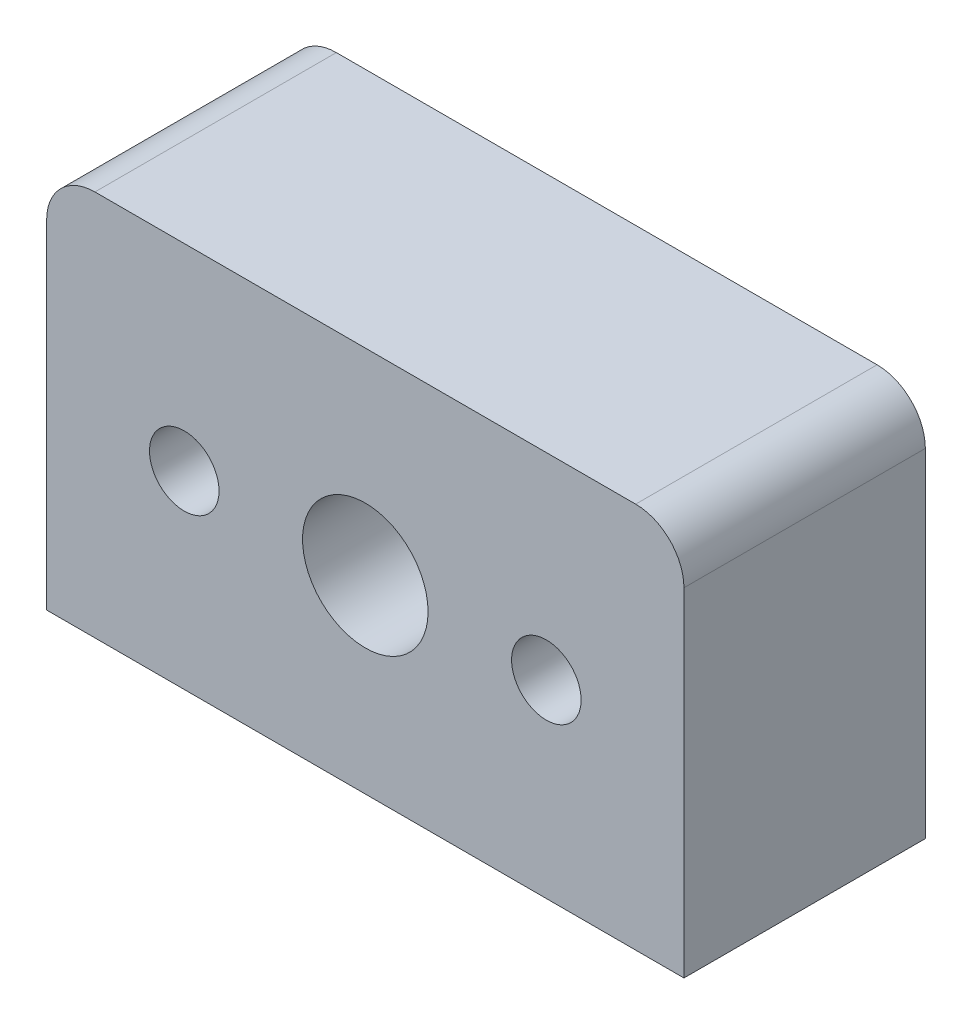
ISO-10303-21;
HEADER;
FILE_DESCRIPTION(('STEP AP214'),'2;1');
FILE_NAME('part.step','',(''),(''),'','','');
FILE_SCHEMA(('AUTOMOTIVE_DESIGN { 1 0 10303 214 1 1 1 1 }'));
ENDSEC;
DATA;
#1=APPLICATION_CONTEXT('core data for automotive mechanical design processes');
#2=APPLICATION_PROTOCOL_DEFINITION('international standard','automotive_design',2000,#1);
#3=PRODUCT_CONTEXT('',#1,'mechanical');
#4=PRODUCT('Part','Part','',(#3));
#5=PRODUCT_RELATED_PRODUCT_CATEGORY('part','',(#4));
#6=PRODUCT_DEFINITION_FORMATION('','',#4);
#7=PRODUCT_DEFINITION_CONTEXT('part definition',#1,'design');
#8=PRODUCT_DEFINITION('design','',#6,#7);
#9=PRODUCT_DEFINITION_SHAPE('','',#8);
#10=(LENGTH_UNIT() NAMED_UNIT(*) SI_UNIT(.MILLI.,.METRE.));
#11=(NAMED_UNIT(*) PLANE_ANGLE_UNIT() SI_UNIT($,.RADIAN.));
#12=(NAMED_UNIT(*) SI_UNIT($,.STERADIAN.) SOLID_ANGLE_UNIT());
#13=UNCERTAINTY_MEASURE_WITH_UNIT(LENGTH_MEASURE(1.E-05),#10,'distance_accuracy_value','');
#14=(GEOMETRIC_REPRESENTATION_CONTEXT(3) GLOBAL_UNCERTAINTY_ASSIGNED_CONTEXT((#13)) GLOBAL_UNIT_ASSIGNED_CONTEXT((#10,
#11,#12)) REPRESENTATION_CONTEXT('',''));
#15=CARTESIAN_POINT('',(0.,0.,0.));
#16=DIRECTION('',(0.,0.,1.));
#17=DIRECTION('',(1.,0.,0.));
#18=AXIS2_PLACEMENT_3D('',#15,#16,#17);
#19=CARTESIAN_POINT('',(0.,0.,-12.7));
#20=DIRECTION('',(1.,0.,0.));
#21=DIRECTION('',(0.,1.,0.));
#22=AXIS2_PLACEMENT_3D('',#19,#20,#21);
#23=PLANE('',#22);
#24=DIRECTION('',(0.,-1.,0.));
#25=VECTOR('',#24,1.);
#26=CARTESIAN_POINT('',(0.,0.,-12.7));
#27=LINE('',#26,#25);
#28=CARTESIAN_POINT('',(0.,17.78,-12.7));
#29=VERTEX_POINT('',#28);
#30=CARTESIAN_POINT('',(0.,0.,-12.7));
#31=VERTEX_POINT('',#30);
#32=EDGE_CURVE('E145',#29,#31,#27,.T.);
#33=ORIENTED_EDGE('',*,*,#32,.T.);
#34=DIRECTION('',(0.,0.,1.));
#35=VECTOR('',#34,1.);
#36=CARTESIAN_POINT('',(0.,0.,-12.7));
#37=LINE('',#36,#35);
#38=CARTESIAN_POINT('',(0.,0.,0.));
#39=VERTEX_POINT('',#38);
#40=EDGE_CURVE('E171',#31,#39,#37,.T.);
#41=ORIENTED_EDGE('',*,*,#40,.T.);
#42=DIRECTION('',(0.,-1.,0.));
#43=VECTOR('',#42,1.);
#44=CARTESIAN_POINT('',(0.,0.,0.));
#45=LINE('',#44,#43);
#46=CARTESIAN_POINT('',(0.,17.78,0.));
#47=VERTEX_POINT('',#46);
#48=EDGE_CURVE('E142',#47,#39,#45,.T.);
#49=ORIENTED_EDGE('',*,*,#48,.F.);
#50=DIRECTION('',(0.,0.,1.));
#51=VECTOR('',#50,1.);
#52=CARTESIAN_POINT('',(0.,17.78,-12.7));
#53=LINE('',#52,#51);
#54=EDGE_CURVE('E174',#29,#47,#53,.T.);
#55=ORIENTED_EDGE('',*,*,#54,.F.);
#56=EDGE_LOOP('',(#33,#41,#49,#55));
#57=FACE_BOUND('',#56,.T.);
#58=ADVANCED_FACE('F39',(#57),#23,.F.);
#59=CARTESIAN_POINT('',(0.,0.,-12.7));
#60=DIRECTION('',(0.,1.,0.));
#61=DIRECTION('',(0.,0.,-1.));
#62=AXIS2_PLACEMENT_3D('',#59,#60,#61);
#63=PLANE('',#62);
#64=CARTESIAN_POINT('',(11.43,0.,-6.35));
#65=DIRECTION('',(0.,1.,0.));
#66=DIRECTION('',(0.,0.,1.));
#67=AXIS2_PLACEMENT_3D('',#64,#65,#66);
#68=CIRCLE('',#67,1.35254999999999);
#69=CARTESIAN_POINT('',(11.43,0.,-4.99745000000001));
#70=VERTEX_POINT('',#69);
#71=EDGE_CURVE('E104',#70,#70,#68,.T.);
#72=ORIENTED_EDGE('',*,*,#71,.T.);
#73=EDGE_LOOP('',(#72));
#74=FACE_BOUND('',#73,.T.);
#75=CARTESIAN_POINT('',(22.098,0.,-6.35));
#76=DIRECTION('',(0.,1.,0.));
#77=DIRECTION('',(0.,0.,1.));
#78=AXIS2_PLACEMENT_3D('',#75,#76,#77);
#79=CIRCLE('',#78,1.35254999999999);
#80=CARTESIAN_POINT('',(22.098,0.,-4.99745000000001));
#81=VERTEX_POINT('',#80);
#82=EDGE_CURVE('E103',#81,#81,#79,.T.);
#83=ORIENTED_EDGE('',*,*,#82,.T.);
#84=EDGE_LOOP('',(#83));
#85=FACE_BOUND('',#84,.T.);
#86=DIRECTION('',(1.,0.,0.));
#87=VECTOR('',#86,1.);
#88=CARTESIAN_POINT('',(0.,0.,0.));
#89=LINE('',#88,#87);
#90=CARTESIAN_POINT('',(33.528,0.,0.));
#91=VERTEX_POINT('',#90);
#92=EDGE_CURVE('E161',#39,#91,#89,.T.);
#93=ORIENTED_EDGE('',*,*,#92,.F.);
#94=ORIENTED_EDGE('',*,*,#40,.F.);
#95=DIRECTION('',(1.,0.,0.));
#96=VECTOR('',#95,1.);
#97=CARTESIAN_POINT('',(0.,0.,-12.7));
#98=LINE('',#97,#96);
#99=CARTESIAN_POINT('',(33.528,0.,-12.7));
#100=VERTEX_POINT('',#99);
#101=EDGE_CURVE('E148',#31,#100,#98,.T.);
#102=ORIENTED_EDGE('',*,*,#101,.T.);
#103=DIRECTION('',(0.,0.,1.));
#104=VECTOR('',#103,1.);
#105=CARTESIAN_POINT('',(33.528,0.,-12.7));
#106=LINE('',#105,#104);
#107=EDGE_CURVE('E158',#100,#91,#106,.T.);
#108=ORIENTED_EDGE('',*,*,#107,.T.);
#109=EDGE_LOOP('',(#93,#94,#102,#108));
#110=FACE_BOUND('',#109,.T.);
#111=ADVANCED_FACE('F196',(#74,#85,#110),#63,.F.);
#112=CARTESIAN_POINT('',(33.528,0.,-12.7));
#113=DIRECTION('',(-1.,0.,0.));
#114=DIRECTION('',(0.,-1.,0.));
#115=AXIS2_PLACEMENT_3D('',#112,#113,#114);
#116=PLANE('',#115);
#117=DIRECTION('',(0.,1.,0.));
#118=VECTOR('',#117,1.);
#119=CARTESIAN_POINT('',(33.528,0.,0.));
#120=LINE('',#119,#118);
#121=CARTESIAN_POINT('',(33.528,17.78,0.));
#122=VERTEX_POINT('',#121);
#123=EDGE_CURVE('E164',#91,#122,#120,.T.);
#124=ORIENTED_EDGE('',*,*,#123,.F.);
#125=ORIENTED_EDGE('',*,*,#107,.F.);
#126=DIRECTION('',(0.,1.,0.));
#127=VECTOR('',#126,1.);
#128=CARTESIAN_POINT('',(33.528,0.,-12.7));
#129=LINE('',#128,#127);
#130=CARTESIAN_POINT('',(33.528,17.78,-12.7));
#131=VERTEX_POINT('',#130);
#132=EDGE_CURVE('E152',#100,#131,#129,.T.);
#133=ORIENTED_EDGE('',*,*,#132,.T.);
#134=DIRECTION('',(0.,0.,1.));
#135=VECTOR('',#134,1.);
#136=CARTESIAN_POINT('',(33.528,17.78,-12.7));
#137=LINE('',#136,#135);
#138=EDGE_CURVE('E11',#122,#131,#137,.F.);
#139=ORIENTED_EDGE('',*,*,#138,.F.);
#140=EDGE_LOOP('',(#124,#125,#133,#139));
#141=FACE_BOUND('',#140,.T.);
#142=ADVANCED_FACE('F206',(#141),#116,.F.);
#143=CARTESIAN_POINT('',(0.,20.32,-12.7));
#144=DIRECTION('',(0.,-1.,0.));
#145=DIRECTION('',(0.,0.,1.));
#146=AXIS2_PLACEMENT_3D('',#143,#144,#145);
#147=PLANE('',#146);
#148=DIRECTION('',(-1.,0.,0.));
#149=VECTOR('',#148,1.);
#150=CARTESIAN_POINT('',(0.,20.32,0.));
#151=LINE('',#150,#149);
#152=CARTESIAN_POINT('',(30.988,20.32,0.));
#153=VERTEX_POINT('',#152);
#154=CARTESIAN_POINT('',(2.53999999999999,20.32,0.));
#155=VERTEX_POINT('',#154);
#156=EDGE_CURVE('E149',#153,#155,#151,.T.);
#157=ORIENTED_EDGE('',*,*,#156,.F.);
#158=DIRECTION('',(0.,0.,1.));
#159=VECTOR('',#158,1.);
#160=CARTESIAN_POINT('',(30.988,20.32,-12.7));
#161=LINE('',#160,#159);
#162=CARTESIAN_POINT('',(30.988,20.32,-12.7));
#163=VERTEX_POINT('',#162);
#164=EDGE_CURVE('E181',#163,#153,#161,.T.);
#165=ORIENTED_EDGE('',*,*,#164,.F.);
#166=DIRECTION('',(-1.,0.,0.));
#167=VECTOR('',#166,1.);
#168=CARTESIAN_POINT('',(0.,20.32,-12.7));
#169=LINE('',#168,#167);
#170=CARTESIAN_POINT('',(2.53999999999999,20.32,-12.7));
#171=VERTEX_POINT('',#170);
#172=EDGE_CURVE('E155',#163,#171,#169,.T.);
#173=ORIENTED_EDGE('',*,*,#172,.T.);
#174=DIRECTION('',(0.,0.,1.));
#175=VECTOR('',#174,1.);
#176=CARTESIAN_POINT('',(2.53999999999999,20.32,-12.7));
#177=LINE('',#176,#175);
#178=EDGE_CURVE('E184',#155,#171,#177,.F.);
#179=ORIENTED_EDGE('',*,*,#178,.F.);
#180=EDGE_LOOP('',(#157,#165,#173,#179));
#181=FACE_BOUND('',#180,.T.);
#182=ADVANCED_FACE('F201',(#181),#147,.F.);
#183=CARTESIAN_POINT('',(0.,0.,-12.7));
#184=DIRECTION('',(0.,0.,1.));
#185=DIRECTION('',(-1.,0.,0.));
#186=AXIS2_PLACEMENT_3D('',#183,#184,#185);
#187=PLANE('',#186);
#188=CARTESIAN_POINT('',(7.23899999999999,9.9568,-12.7));
#189=DIRECTION('',(0.,0.,1.));
#190=DIRECTION('',(1.,0.,0.));
#191=AXIS2_PLACEMENT_3D('',#188,#189,#190);
#192=CIRCLE('',#191,3.57251);
#193=CARTESIAN_POINT('',(10.81151,9.9568,-12.7));
#194=VERTEX_POINT('',#193);
#195=EDGE_CURVE('E114',#194,#194,#192,.T.);
#196=ORIENTED_EDGE('',*,*,#195,.T.);
#197=EDGE_LOOP('',(#196));
#198=FACE_BOUND('',#197,.T.);
#199=CARTESIAN_POINT('',(26.289,9.9568,-12.7));
#200=DIRECTION('',(0.,0.,1.));
#201=DIRECTION('',(1.,0.,0.));
#202=AXIS2_PLACEMENT_3D('',#199,#200,#201);
#203=CIRCLE('',#202,3.57251);
#204=CARTESIAN_POINT('',(29.86151,9.9568,-12.7));
#205=VERTEX_POINT('',#204);
#206=EDGE_CURVE('E126',#205,#205,#203,.T.);
#207=ORIENTED_EDGE('',*,*,#206,.T.);
#208=EDGE_LOOP('',(#207));
#209=FACE_BOUND('',#208,.T.);
#210=CARTESIAN_POINT('',(16.764,9.9568,-12.7));
#211=DIRECTION('',(0.,0.,1.));
#212=DIRECTION('',(1.,0.,0.));
#213=AXIS2_PLACEMENT_3D('',#210,#211,#212);
#214=CIRCLE('',#213,3.302);
#215=CARTESIAN_POINT('',(20.066,9.9568,-12.7));
#216=VERTEX_POINT('',#215);
#217=EDGE_CURVE('E138',#216,#216,#214,.T.);
#218=ORIENTED_EDGE('',*,*,#217,.T.);
#219=EDGE_LOOP('',(#218));
#220=FACE_BOUND('',#219,.T.);
#221=ORIENTED_EDGE('',*,*,#172,.F.);
#222=CARTESIAN_POINT('',(30.988,17.78,-12.7));
#223=DIRECTION('',(0.,0.,-1.));
#224=DIRECTION('',(-1.,0.,0.));
#225=AXIS2_PLACEMENT_3D('',#222,#223,#224);
#226=CIRCLE('',#225,2.54);
#227=EDGE_CURVE('E54',#131,#163,#226,.F.);
#228=ORIENTED_EDGE('',*,*,#227,.F.);
#229=ORIENTED_EDGE('',*,*,#132,.F.);
#230=ORIENTED_EDGE('',*,*,#101,.F.);
#231=ORIENTED_EDGE('',*,*,#32,.F.);
#232=CARTESIAN_POINT('',(2.53999999999999,17.78,-12.7));
#233=DIRECTION('',(0.,0.,-1.));
#234=DIRECTION('',(-1.,0.,0.));
#235=AXIS2_PLACEMENT_3D('',#232,#233,#234);
#236=CIRCLE('',#235,2.54);
#237=EDGE_CURVE('E47',#171,#29,#236,.F.);
#238=ORIENTED_EDGE('',*,*,#237,.F.);
#239=EDGE_LOOP('',(#221,#228,#229,#230,#231,#238));
#240=FACE_BOUND('',#239,.T.);
#241=ADVANCED_FACE('F192',(#198,#209,#220,#240),#187,.F.);
#242=CARTESIAN_POINT('',(0.,0.,0.));
#243=DIRECTION('',(0.,0.,1.));
#244=DIRECTION('',(-1.,0.,0.));
#245=AXIS2_PLACEMENT_3D('',#242,#243,#244);
#246=PLANE('',#245);
#247=CARTESIAN_POINT('',(7.23899999999999,9.9568,0.));
#248=DIRECTION('',(0.,0.,1.));
#249=DIRECTION('',(1.,0.,0.));
#250=AXIS2_PLACEMENT_3D('',#247,#248,#249);
#251=CIRCLE('',#250,1.8288);
#252=CARTESIAN_POINT('',(9.06779999999999,9.9568,0.));
#253=VERTEX_POINT('',#252);
#254=EDGE_CURVE('E123',#253,#253,#251,.T.);
#255=ORIENTED_EDGE('',*,*,#254,.F.);
#256=EDGE_LOOP('',(#255));
#257=FACE_BOUND('',#256,.T.);
#258=CARTESIAN_POINT('',(26.289,9.9568,0.));
#259=DIRECTION('',(0.,0.,1.));
#260=DIRECTION('',(1.,0.,0.));
#261=AXIS2_PLACEMENT_3D('',#258,#259,#260);
#262=CIRCLE('',#261,1.8288);
#263=CARTESIAN_POINT('',(28.1178,9.9568,0.));
#264=VERTEX_POINT('',#263);
#265=EDGE_CURVE('E135',#264,#264,#262,.T.);
#266=ORIENTED_EDGE('',*,*,#265,.F.);
#267=EDGE_LOOP('',(#266));
#268=FACE_BOUND('',#267,.T.);
#269=CARTESIAN_POINT('',(16.764,9.9568,0.));
#270=DIRECTION('',(0.,0.,1.));
#271=DIRECTION('',(1.,0.,0.));
#272=AXIS2_PLACEMENT_3D('',#269,#270,#271);
#273=CIRCLE('',#272,3.302);
#274=CARTESIAN_POINT('',(20.066,9.9568,0.));
#275=VERTEX_POINT('',#274);
#276=EDGE_CURVE('E139',#275,#275,#273,.T.);
#277=ORIENTED_EDGE('',*,*,#276,.F.);
#278=EDGE_LOOP('',(#277));
#279=FACE_BOUND('',#278,.T.);
#280=ORIENTED_EDGE('',*,*,#48,.T.);
#281=ORIENTED_EDGE('',*,*,#92,.T.);
#282=ORIENTED_EDGE('',*,*,#123,.T.);
#283=CARTESIAN_POINT('',(30.988,17.78,0.));
#284=DIRECTION('',(0.,0.,-1.));
#285=DIRECTION('',(-1.,0.,0.));
#286=AXIS2_PLACEMENT_3D('',#283,#284,#285);
#287=CIRCLE('',#286,2.54);
#288=EDGE_CURVE('E177',#153,#122,#287,.T.);
#289=ORIENTED_EDGE('',*,*,#288,.F.);
#290=ORIENTED_EDGE('',*,*,#156,.T.);
#291=CARTESIAN_POINT('',(2.53999999999999,17.78,0.));
#292=DIRECTION('',(0.,0.,-1.));
#293=DIRECTION('',(-1.,0.,0.));
#294=AXIS2_PLACEMENT_3D('',#291,#292,#293);
#295=CIRCLE('',#294,2.54);
#296=EDGE_CURVE('E179',#47,#155,#295,.T.);
#297=ORIENTED_EDGE('',*,*,#296,.F.);
#298=EDGE_LOOP('',(#280,#281,#282,#289,#290,#297));
#299=FACE_BOUND('',#298,.T.);
#300=ADVANCED_FACE('F198',(#257,#268,#279,#299),#246,.T.);
#301=CARTESIAN_POINT('',(16.764,9.9568,0.));
#302=DIRECTION('',(0.,0.,-1.));
#303=DIRECTION('',(1.,0.,0.));
#304=AXIS2_PLACEMENT_3D('',#301,#302,#303);
#305=CYLINDRICAL_SURFACE('',#304,3.302);
#306=ORIENTED_EDGE('',*,*,#276,.T.);
#307=EDGE_LOOP('',(#306));
#308=FACE_BOUND('',#307,.T.);
#309=ORIENTED_EDGE('',*,*,#217,.F.);
#310=EDGE_LOOP('',(#309));
#311=FACE_BOUND('',#310,.T.);
#312=ADVANCED_FACE('F254',(#308,#311),#305,.F.);
#313=CARTESIAN_POINT('',(26.289,9.9568,-12.7));
#314=DIRECTION('',(0.,0.,-1.));
#315=DIRECTION('',(1.,0.,0.));
#316=AXIS2_PLACEMENT_3D('',#313,#314,#315);
#317=CYLINDRICAL_SURFACE('',#316,1.8288);
#318=ORIENTED_EDGE('',*,*,#265,.T.);
#319=EDGE_LOOP('',(#318));
#320=FACE_BOUND('',#319,.T.);
#321=CARTESIAN_POINT('',(26.289,9.9568,-9.1948));
#322=DIRECTION('',(0.,0.,1.));
#323=DIRECTION('',(1.,0.,0.));
#324=AXIS2_PLACEMENT_3D('',#321,#322,#323);
#325=CIRCLE('',#324,1.8288);
#326=CARTESIAN_POINT('',(28.1178,9.9568,-9.1948));
#327=VERTEX_POINT('',#326);
#328=EDGE_CURVE('E132',#327,#327,#325,.T.);
#329=ORIENTED_EDGE('',*,*,#328,.F.);
#330=EDGE_LOOP('',(#329));
#331=FACE_BOUND('',#330,.T.);
#332=ADVANCED_FACE('F250',(#320,#331),#317,.F.);
#333=CARTESIAN_POINT('',(28.1178,9.9568,-9.1948));
#334=DIRECTION('',(0.,0.,1.));
#335=DIRECTION('',(-1.,0.,0.));
#336=AXIS2_PLACEMENT_3D('',#333,#334,#335);
#337=PLANE('',#336);
#338=ORIENTED_EDGE('',*,*,#328,.T.);
#339=EDGE_LOOP('',(#338));
#340=FACE_BOUND('',#339,.T.);
#341=CARTESIAN_POINT('',(26.289,9.9568,-9.1948));
#342=DIRECTION('',(0.,0.,1.));
#343=DIRECTION('',(1.,0.,0.));
#344=AXIS2_PLACEMENT_3D('',#341,#342,#343);
#345=CIRCLE('',#344,3.57251);
#346=CARTESIAN_POINT('',(29.86151,9.9568,-9.1948));
#347=VERTEX_POINT('',#346);
#348=EDGE_CURVE('E129',#347,#347,#345,.T.);
#349=ORIENTED_EDGE('',*,*,#348,.F.);
#350=EDGE_LOOP('',(#349));
#351=FACE_BOUND('',#350,.T.);
#352=ADVANCED_FACE('F246',(#340,#351),#337,.F.);
#353=CARTESIAN_POINT('',(26.289,9.9568,-12.7));
#354=DIRECTION('',(0.,0.,-1.));
#355=DIRECTION('',(1.,0.,0.));
#356=AXIS2_PLACEMENT_3D('',#353,#354,#355);
#357=CYLINDRICAL_SURFACE('',#356,3.57251);
#358=ORIENTED_EDGE('',*,*,#348,.T.);
#359=EDGE_LOOP('',(#358));
#360=FACE_BOUND('',#359,.T.);
#361=ORIENTED_EDGE('',*,*,#206,.F.);
#362=EDGE_LOOP('',(#361));
#363=FACE_BOUND('',#362,.T.);
#364=ADVANCED_FACE('F242',(#360,#363),#357,.F.);
#365=CARTESIAN_POINT('',(7.23899999999999,9.9568,-12.7));
#366=DIRECTION('',(0.,0.,-1.));
#367=DIRECTION('',(1.,0.,0.));
#368=AXIS2_PLACEMENT_3D('',#365,#366,#367);
#369=CYLINDRICAL_SURFACE('',#368,1.8288);
#370=ORIENTED_EDGE('',*,*,#254,.T.);
#371=EDGE_LOOP('',(#370));
#372=FACE_BOUND('',#371,.T.);
#373=CARTESIAN_POINT('',(7.23899999999999,9.9568,-9.1948));
#374=DIRECTION('',(0.,0.,1.));
#375=DIRECTION('',(1.,0.,0.));
#376=AXIS2_PLACEMENT_3D('',#373,#374,#375);
#377=CIRCLE('',#376,1.8288);
#378=CARTESIAN_POINT('',(9.06779999999999,9.9568,-9.1948));
#379=VERTEX_POINT('',#378);
#380=EDGE_CURVE('E120',#379,#379,#377,.T.);
#381=ORIENTED_EDGE('',*,*,#380,.F.);
#382=EDGE_LOOP('',(#381));
#383=FACE_BOUND('',#382,.T.);
#384=ADVANCED_FACE('F233',(#372,#383),#369,.F.);
#385=CARTESIAN_POINT('',(9.06779999999999,9.9568,-9.1948));
#386=DIRECTION('',(0.,0.,1.));
#387=DIRECTION('',(-1.,0.,0.));
#388=AXIS2_PLACEMENT_3D('',#385,#386,#387);
#389=PLANE('',#388);
#390=ORIENTED_EDGE('',*,*,#380,.T.);
#391=EDGE_LOOP('',(#390));
#392=FACE_BOUND('',#391,.T.);
#393=CARTESIAN_POINT('',(7.23899999999999,9.9568,-9.1948));
#394=DIRECTION('',(0.,0.,1.));
#395=DIRECTION('',(1.,0.,0.));
#396=AXIS2_PLACEMENT_3D('',#393,#394,#395);
#397=CIRCLE('',#396,3.57251);
#398=CARTESIAN_POINT('',(10.81151,9.9568,-9.1948));
#399=VERTEX_POINT('',#398);
#400=EDGE_CURVE('E117',#399,#399,#397,.T.);
#401=ORIENTED_EDGE('',*,*,#400,.F.);
#402=EDGE_LOOP('',(#401));
#403=FACE_BOUND('',#402,.T.);
#404=ADVANCED_FACE('F227',(#392,#403),#389,.F.);
#405=CARTESIAN_POINT('',(7.23899999999999,9.9568,-12.7));
#406=DIRECTION('',(0.,0.,-1.));
#407=DIRECTION('',(1.,0.,0.));
#408=AXIS2_PLACEMENT_3D('',#405,#406,#407);
#409=CYLINDRICAL_SURFACE('',#408,3.57251);
#410=ORIENTED_EDGE('',*,*,#400,.T.);
#411=EDGE_LOOP('',(#410));
#412=FACE_BOUND('',#411,.T.);
#413=ORIENTED_EDGE('',*,*,#195,.F.);
#414=EDGE_LOOP('',(#413));
#415=FACE_BOUND('',#414,.T.);
#416=ADVANCED_FACE('F221',(#412,#415),#409,.F.);
#417=CARTESIAN_POINT('',(2.53999999999999,17.78,-12.7));
#418=DIRECTION('',(0.,0.,1.));
#419=DIRECTION('',(-1.,0.,0.));
#420=AXIS2_PLACEMENT_3D('',#417,#418,#419);
#421=CYLINDRICAL_SURFACE('',#420,2.54);
#422=ORIENTED_EDGE('',*,*,#237,.T.);
#423=ORIENTED_EDGE('',*,*,#54,.T.);
#424=ORIENTED_EDGE('',*,*,#296,.T.);
#425=ORIENTED_EDGE('',*,*,#178,.T.);
#426=EDGE_LOOP('',(#422,#423,#424,#425));
#427=FACE_BOUND('',#426,.T.);
#428=ADVANCED_FACE('F188',(#427),#421,.T.);
#429=CARTESIAN_POINT('',(30.988,17.78,-12.7));
#430=DIRECTION('',(0.,0.,1.));
#431=DIRECTION('',(-1.,0.,0.));
#432=AXIS2_PLACEMENT_3D('',#429,#430,#431);
#433=CYLINDRICAL_SURFACE('',#432,2.54);
#434=ORIENTED_EDGE('',*,*,#227,.T.);
#435=ORIENTED_EDGE('',*,*,#164,.T.);
#436=ORIENTED_EDGE('',*,*,#288,.T.);
#437=ORIENTED_EDGE('',*,*,#138,.T.);
#438=EDGE_LOOP('',(#434,#435,#436,#437));
#439=FACE_BOUND('',#438,.T.);
#440=ADVANCED_FACE('F41',(#439),#433,.T.);
#441=CARTESIAN_POINT('',(22.098,7.62,-6.35));
#442=DIRECTION('',(0.,-1.,0.));
#443=DIRECTION('',(0.,0.,1.));
#444=AXIS2_PLACEMENT_3D('',#441,#442,#443);
#445=CONICAL_SURFACE('',#444,1.35255,1.02974425867665);
#446=CARTESIAN_POINT('',(22.098,8.43269403026573,-6.35));
#447=VERTEX_POINT('',#446);
#448=VERTEX_LOOP('',#447);
#449=FACE_BOUND('',#448,.T.);
#450=CARTESIAN_POINT('',(22.098,7.62,-6.35));
#451=DIRECTION('',(0.,1.,0.));
#452=DIRECTION('',(0.,0.,1.));
#453=AXIS2_PLACEMENT_3D('',#450,#451,#452);
#454=CIRCLE('',#453,1.35255);
#455=CARTESIAN_POINT('',(22.098,7.62,-4.99745000000001));
#456=VERTEX_POINT('',#455);
#457=EDGE_CURVE('E107',#456,#456,#454,.T.);
#458=ORIENTED_EDGE('',*,*,#457,.F.);
#459=EDGE_LOOP('',(#458));
#460=FACE_BOUND('',#459,.T.);
#461=ADVANCED_FACE('F226',(#449,#460),#445,.F.);
#462=CARTESIAN_POINT('',(22.098,0.,-6.35));
#463=DIRECTION('',(0.,-1.,0.));
#464=DIRECTION('',(0.,0.,1.));
#465=AXIS2_PLACEMENT_3D('',#462,#463,#464);
#466=CYLINDRICAL_SURFACE('',#465,1.35254999999999);
#467=ORIENTED_EDGE('',*,*,#457,.T.);
#468=EDGE_LOOP('',(#467));
#469=FACE_BOUND('',#468,.T.);
#470=ORIENTED_EDGE('',*,*,#82,.F.);
#471=EDGE_LOOP('',(#470));
#472=FACE_BOUND('',#471,.T.);
#473=ADVANCED_FACE('F97',(#469,#472),#466,.F.);
#474=CARTESIAN_POINT('',(11.43,7.62,-6.35));
#475=DIRECTION('',(0.,-1.,0.));
#476=DIRECTION('',(0.,0.,1.));
#477=AXIS2_PLACEMENT_3D('',#474,#475,#476);
#478=CONICAL_SURFACE('',#477,1.35255,1.02974425867665);
#479=CARTESIAN_POINT('',(11.43,8.43269403026573,-6.35));
#480=VERTEX_POINT('',#479);
#481=VERTEX_LOOP('',#480);
#482=FACE_BOUND('',#481,.T.);
#483=CARTESIAN_POINT('',(11.43,7.62,-6.35));
#484=DIRECTION('',(0.,1.,0.));
#485=DIRECTION('',(0.,0.,1.));
#486=AXIS2_PLACEMENT_3D('',#483,#484,#485);
#487=CIRCLE('',#486,1.35255);
#488=CARTESIAN_POINT('',(11.43,7.62,-4.99745));
#489=VERTEX_POINT('',#488);
#490=EDGE_CURVE('E101',#489,#489,#487,.T.);
#491=ORIENTED_EDGE('',*,*,#490,.F.);
#492=EDGE_LOOP('',(#491));
#493=FACE_BOUND('',#492,.T.);
#494=ADVANCED_FACE('F93',(#482,#493),#478,.F.);
#495=CARTESIAN_POINT('',(11.43,0.,-6.35));
#496=DIRECTION('',(0.,-1.,0.));
#497=DIRECTION('',(0.,0.,1.));
#498=AXIS2_PLACEMENT_3D('',#495,#496,#497);
#499=CYLINDRICAL_SURFACE('',#498,1.35254999999999);
#500=ORIENTED_EDGE('',*,*,#490,.T.);
#501=EDGE_LOOP('',(#500));
#502=FACE_BOUND('',#501,.T.);
#503=ORIENTED_EDGE('',*,*,#71,.F.);
#504=EDGE_LOOP('',(#503));
#505=FACE_BOUND('',#504,.T.);
#506=ADVANCED_FACE('F96',(#502,#505),#499,.F.);
#507=CLOSED_SHELL('',(#58,#111,#142,#182,#241,#300,#312,#332,#352,#364,#384,#404,#416,#428,#440,
#461,#473,#494,#506));
#508=MANIFOLD_SOLID_BREP('B2',#507);
#509=ADVANCED_BREP_SHAPE_REPRESENTATION('',(#18,#508),#14);
#510=SHAPE_DEFINITION_REPRESENTATION(#9,#509);
ENDSEC;
END-ISO-10303-21;
